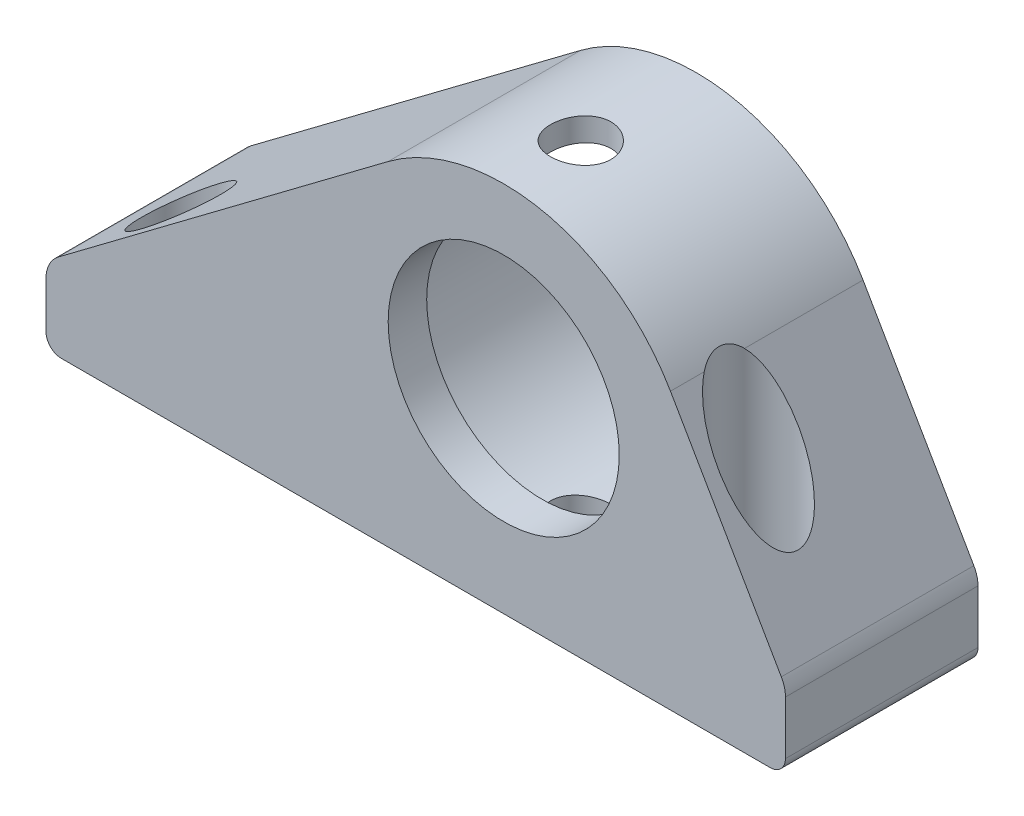
ISO-10303-21;
HEADER;
FILE_DESCRIPTION(('STEP AP214'),'2;1');
FILE_NAME('part.step','',(''),(''),'','','');
FILE_SCHEMA(('AUTOMOTIVE_DESIGN { 1 0 10303 214 1 1 1 1 }'));
ENDSEC;
DATA;
#1=APPLICATION_CONTEXT('core data for automotive mechanical design processes');
#2=APPLICATION_PROTOCOL_DEFINITION('international standard','automotive_design',2000,#1);
#3=PRODUCT_CONTEXT('',#1,'mechanical');
#4=PRODUCT('Part','Part','',(#3));
#5=PRODUCT_RELATED_PRODUCT_CATEGORY('part','',(#4));
#6=PRODUCT_DEFINITION_FORMATION('','',#4);
#7=PRODUCT_DEFINITION_CONTEXT('part definition',#1,'design');
#8=PRODUCT_DEFINITION('design','',#6,#7);
#9=PRODUCT_DEFINITION_SHAPE('','',#8);
#10=(LENGTH_UNIT() NAMED_UNIT(*) SI_UNIT(.MILLI.,.METRE.));
#11=(NAMED_UNIT(*) PLANE_ANGLE_UNIT() SI_UNIT($,.RADIAN.));
#12=(NAMED_UNIT(*) SI_UNIT($,.STERADIAN.) SOLID_ANGLE_UNIT());
#13=UNCERTAINTY_MEASURE_WITH_UNIT(LENGTH_MEASURE(1.E-05),#10,'distance_accuracy_value','');
#14=(GEOMETRIC_REPRESENTATION_CONTEXT(3) GLOBAL_UNCERTAINTY_ASSIGNED_CONTEXT((#13)) GLOBAL_UNIT_ASSIGNED_CONTEXT((#10,
#11,#12)) REPRESENTATION_CONTEXT('',''));
#15=CARTESIAN_POINT('',(0.,0.,0.));
#16=DIRECTION('',(0.,0.,1.));
#17=DIRECTION('',(1.,0.,0.));
#18=AXIS2_PLACEMENT_3D('',#15,#16,#17);
#19=CARTESIAN_POINT('',(30.48,0.,15.875));
#20=DIRECTION('',(0.,1.,0.));
#21=DIRECTION('',(-1.,0.,0.));
#22=AXIS2_PLACEMENT_3D('',#19,#20,#21);
#23=PLANE('',#22);
#24=CARTESIAN_POINT('',(-23.8125,0.,11.43));
#25=DIRECTION('',(0.,-1.,0.));
#26=DIRECTION('',(1.,0.,0.));
#27=AXIS2_PLACEMENT_3D('',#24,#25,#26);
#28=CIRCLE('',#27,3.2639);
#29=CARTESIAN_POINT('',(-20.5486,0.,11.43));
#30=VERTEX_POINT('',#29);
#31=EDGE_CURVE('E460',#30,#30,#28,.T.);
#32=ORIENTED_EDGE('',*,*,#31,.F.);
#33=EDGE_LOOP('',(#32));
#34=FACE_BOUND('',#33,.T.);
#35=CARTESIAN_POINT('',(7.25400300007424,0.,9.525));
#36=DIRECTION('',(0.,-1.,0.));
#37=DIRECTION('',(1.,0.,0.));
#38=AXIS2_PLACEMENT_3D('',#35,#36,#37);
#39=CIRCLE('',#38,2.4892);
#40=CARTESIAN_POINT('',(9.74320300007424,0.,9.525));
#41=VERTEX_POINT('',#40);
#42=EDGE_CURVE('E160',#41,#41,#39,.T.);
#43=ORIENTED_EDGE('',*,*,#42,.F.);
#44=EDGE_LOOP('',(#43));
#45=FACE_BOUND('',#44,.T.);
#46=DIRECTION('',(1.,0.,0.));
#47=VECTOR('',#46,1.);
#48=CARTESIAN_POINT('',(30.48,0.,0.));
#49=LINE('',#48,#47);
#50=CARTESIAN_POINT('',(-29.21,0.,0.));
#51=VERTEX_POINT('',#50);
#52=CARTESIAN_POINT('',(29.21,0.,0.));
#53=VERTEX_POINT('',#52);
#54=EDGE_CURVE('E249',#51,#53,#49,.T.);
#55=ORIENTED_EDGE('',*,*,#54,.T.);
#56=DIRECTION('',(0.,0.,-1.));
#57=VECTOR('',#56,1.);
#58=CARTESIAN_POINT('',(29.21,0.,15.875));
#59=LINE('',#58,#57);
#60=CARTESIAN_POINT('',(29.21,0.,15.875));
#61=VERTEX_POINT('',#60);
#62=EDGE_CURVE('E216',#53,#61,#59,.F.);
#63=ORIENTED_EDGE('',*,*,#62,.T.);
#64=DIRECTION('',(1.,0.,0.));
#65=VECTOR('',#64,1.);
#66=CARTESIAN_POINT('',(30.48,0.,15.875));
#67=LINE('',#66,#65);
#68=CARTESIAN_POINT('',(-29.21,0.,15.875));
#69=VERTEX_POINT('',#68);
#70=EDGE_CURVE('E269',#69,#61,#67,.T.);
#71=ORIENTED_EDGE('',*,*,#70,.F.);
#72=DIRECTION('',(0.,0.,-1.));
#73=VECTOR('',#72,1.);
#74=CARTESIAN_POINT('',(-29.21,0.,15.875));
#75=LINE('',#74,#73);
#76=EDGE_CURVE('E213',#69,#51,#75,.T.);
#77=ORIENTED_EDGE('',*,*,#76,.T.);
#78=EDGE_LOOP('',(#55,#63,#71,#77));
#79=FACE_BOUND('',#78,.T.);
#80=CARTESIAN_POINT('',(23.8125,0.,11.43));
#81=DIRECTION('',(0.,1.,0.));
#82=DIRECTION('',(-1.,0.,0.));
#83=AXIS2_PLACEMENT_3D('',#80,#81,#82);
#84=CIRCLE('',#83,3.2639);
#85=CARTESIAN_POINT('',(20.5486,0.,11.43));
#86=VERTEX_POINT('',#85);
#87=EDGE_CURVE('E459',#86,#86,#84,.T.);
#88=ORIENTED_EDGE('',*,*,#87,.T.);
#89=EDGE_LOOP('',(#88));
#90=FACE_BOUND('',#89,.T.);
#91=ADVANCED_FACE('F33',(#34,#45,#79,#90),#23,.F.);
#92=CARTESIAN_POINT('',(7.25400300007437,14.8286068603137,15.875));
#93=DIRECTION('',(0.,0.,-1.));
#94=DIRECTION('',(-1.,0.,0.));
#95=AXIS2_PLACEMENT_3D('',#92,#93,#94);
#96=CYLINDRICAL_SURFACE('',#95,15.875);
#97=CARTESIAN_POINT('',(7.25400300007436,30.7036068603138,7.0358));
#98=CARTESIAN_POINT('',(7.11509694516908,30.7036045670808,7.03580566830738));
#99=CARTESIAN_POINT('',(6.97611218193528,30.7017646601866,7.04746642785593));
#100=CARTESIAN_POINT('',(6.70203273456269,30.6946020213534,7.09378656350196));
#101=CARTESIAN_POINT('',(6.56694188282754,30.6892759728483,7.12846784077944));
#102=CARTESIAN_POINT('',(6.30465595873273,30.6757391275832,7.2197628200422));
#103=CARTESIAN_POINT('',(6.17745481318327,30.667530582914,7.27635940315972));
#104=CARTESIAN_POINT('',(5.93437285248977,30.649134007626,7.40983538252463));
#105=CARTESIAN_POINT('',(5.81849057811306,30.6389462326777,7.48671215950087));
#106=CARTESIAN_POINT('',(5.60033208226753,30.6176258243704,7.65926248892496));
#107=CARTESIAN_POINT('',(5.49816608869203,30.606486591927,7.75507460388897));
#108=CARTESIAN_POINT('',(5.31129175300056,30.584569925567,7.96247763511765));
#109=CARTESIAN_POINT('',(5.2265844527291,30.5737925132742,8.07406949236609));
#110=CARTESIAN_POINT('',(5.07659786405079,30.5537557811859,8.31061159654533));
#111=CARTESIAN_POINT('',(5.01142616602649,30.5445049901566,8.43563084963722));
#112=CARTESIAN_POINT('',(4.90304851035311,30.5286596153741,8.69501078415887));
#113=CARTESIAN_POINT('',(4.85984124295902,30.5220648732449,8.82937090804669));
#114=CARTESIAN_POINT('',(4.796963270964,30.5123434963266,9.10245557095464));
#115=CARTESIAN_POINT('',(4.77710320592831,30.5091889745406,9.24113549846165));
#116=CARTESIAN_POINT('',(4.76089657591027,30.5066206687459,9.51989261664841));
#117=CARTESIAN_POINT('',(4.76454853711459,30.5072066502696,9.65996971919892));
#118=CARTESIAN_POINT('',(4.79510774717881,30.5120276567733,9.93620169534438));
#119=CARTESIAN_POINT('',(4.82180337883591,30.5162294753171,10.0723806432635));
#120=CARTESIAN_POINT('',(4.8973605430947,30.527756802887,10.3383023139324));
#121=CARTESIAN_POINT('',(4.94622275573279,30.5350824077457,10.4680448390872));
#122=CARTESIAN_POINT('',(5.06494395719598,30.5520682573595,10.7180505107717));
#123=CARTESIAN_POINT('',(5.1348918830656,30.5617383564174,10.838270726423));
#124=CARTESIAN_POINT('',(5.29373568546493,30.5823166097519,11.0653477084882));
#125=CARTESIAN_POINT('',(5.38263291891857,30.5932248526635,11.1722035170324));
#126=CARTESIAN_POINT('',(5.5780100666752,30.6151967100365,11.3707443017527));
#127=CARTESIAN_POINT('',(5.68467177504527,30.6262607183034,11.4622504315872));
#128=CARTESIAN_POINT('',(5.91193242728109,30.6471868004637,11.6260915712206));
#129=CARTESIAN_POINT('',(6.0325314428575,30.6570488681723,11.6984264823729));
#130=CARTESIAN_POINT('',(6.28440356404981,30.6744715991477,11.8218838501579));
#131=CARTESIAN_POINT('',(6.41568393735495,30.6820306785657,11.8729917169162));
#132=CARTESIAN_POINT('',(6.68510938025784,30.693982711525,11.9523846061197));
#133=CARTESIAN_POINT('',(6.8232539414809,30.6983758991658,11.9806713160762));
#134=CARTESIAN_POINT('',(7.10094359993342,30.7034699636867,12.0133792873864));
#135=CARTESIAN_POINT('',(7.24045908082882,30.7042088572259,12.0180462832909));
#136=CARTESIAN_POINT('',(7.51827959411447,30.7020148184516,12.0040357439755));
#137=CARTESIAN_POINT('',(7.65658466740221,30.6990820106842,11.9853590005889));
#138=CARTESIAN_POINT('',(7.92730824076356,30.6898976195341,11.9253955128908));
#139=CARTESIAN_POINT('',(8.05975407998652,30.6836637272211,11.8842292567787));
#140=CARTESIAN_POINT('',(8.31586409195264,30.6685736529816,11.7805829101506));
#141=CARTESIAN_POINT('',(8.43952781928167,30.6597173381678,11.7181017395089));
#142=CARTESIAN_POINT('',(8.67563860325786,30.6402714771111,11.5730280962491));
#143=CARTESIAN_POINT('',(8.78798935863075,30.6296687944835,11.4902806848561));
#144=CARTESIAN_POINT('',(8.99729740357999,30.607949148022,11.3072381432372));
#145=CARTESIAN_POINT('',(9.09425370997436,30.5968321513994,11.2069418930963));
#146=CARTESIAN_POINT('',(9.27092141526545,30.5752153365864,10.990551469592));
#147=CARTESIAN_POINT('',(9.3504675633996,30.5647220679579,10.8743216252251));
#148=CARTESIAN_POINT('',(9.48890613070782,30.5456592820025,10.630005260061));
#149=CARTESIAN_POINT('',(9.54779914763274,30.537089709002,10.50191908255));
#150=CARTESIAN_POINT('',(9.64300711014341,30.5228927057636,10.2380065380913));
#151=CARTESIAN_POINT('',(9.67940715067546,30.5172541997979,10.1022114919798));
#152=CARTESIAN_POINT('',(9.72886557579246,30.5095289481787,9.82633991313193));
#153=CARTESIAN_POINT('',(9.74192573584276,30.5074419323638,9.68626370688804));
#154=CARTESIAN_POINT('',(9.74428853977138,30.5070666718644,9.40745431443618));
#155=CARTESIAN_POINT('',(9.7338511167597,30.5087368643308,9.26872331762411));
#156=CARTESIAN_POINT('',(9.6900740514347,30.515597201827,8.99501636082486));
#157=CARTESIAN_POINT('',(9.65673445991303,30.5207873390504,8.86004039251059));
#158=CARTESIAN_POINT('',(9.56819443372131,30.534087734728,8.59775830460762));
#159=CARTESIAN_POINT('',(9.51301384157173,30.5421953420586,8.47044534380261));
#160=CARTESIAN_POINT('',(9.38238434924553,30.5604201058444,8.226842109909));
#161=CARTESIAN_POINT('',(9.30693463532861,30.5705373429755,8.11055227961739));
#162=CARTESIAN_POINT('',(9.13697081950566,30.5917743120337,7.89097857161323));
#163=CARTESIAN_POINT('',(9.04226469105313,30.6029034623595,7.78784422655511));
#164=CARTESIAN_POINT('',(8.83688213281055,30.62483305306,7.59884086657932));
#165=CARTESIAN_POINT('',(8.72620200791413,30.6356334166778,7.51297585743608));
#166=CARTESIAN_POINT('',(8.49122209404987,30.6557636174166,7.3604800108145));
#167=CARTESIAN_POINT('',(8.36684397860286,30.6650841653116,7.29396864775475));
#168=CARTESIAN_POINT('',(8.10859057986397,30.6811138402597,7.18288238350642));
#169=CARTESIAN_POINT('',(7.9747251443983,30.6878256295893,7.13828510632219));
#170=CARTESIAN_POINT('',(7.74257567355938,30.6963760297984,7.08223803977048));
#171=CARTESIAN_POINT('',(7.64571373853053,30.6990734420586,7.06485088867004));
#172=CARTESIAN_POINT('',(7.45058199718362,30.7026896561761,7.0416299450843));
#173=CARTESIAN_POINT('',(7.35231221090446,30.7036084833238,7.03579598831868));
#174=CARTESIAN_POINT('',(7.25400300007436,30.7036068603138,7.0358));
#175=B_SPLINE_CURVE_WITH_KNOTS('',3,(#97,#98,#99,#100,#101,#102,#103,#104,#105,#106,#107,#108,
#109,#110,#111,#112,#113,#114,#115,#116,#117,#118,#119,#120,#121,#122,#123,#124,#125,#126,#127,
#128,#129,#130,#131,#132,#133,#134,#135,#136,#137,#138,#139,#140,#141,#142,#143,#144,#145,#146,
#147,#148,#149,#150,#151,#152,#153,#154,#155,#156,#157,#158,#159,#160,#161,#162,#163,#164,#165,
#166,#167,#168,#169,#170,#171,#172,#173,#174),.UNSPECIFIED.,.T.,.F.,(4,2,2,2,2,2,2,2,2,2,2,2,2,
2,2,2,2,2,2,2,2,2,2,2,2,2,2,2,2,2,2,2,2,2,2,2,2,2,4),(0.,0.416358886850114,0.833114456601983,
1.24954513752971,1.66592206101775,2.08546693141594,2.50503683083742,2.9268767192471,
3.34869145027715,3.76706086480885,4.18540405478608,4.5999458526052,5.01450036878518,
5.43082849175457,5.8471864372113,6.26810144417729,6.68901861694429,7.11022461967684,
7.5313994734613,7.94818337190888,8.36495313318789,8.77951162893622,9.19409113540896,
9.61194492985803,10.0298254002349,10.4515150266721,10.8731924473988,11.2932646607082,
11.7133049177523,12.1287214978065,12.5441371565667,12.9591762738235,13.3742320560615,
13.793649932368,14.213164984421,14.6352173742595,15.0568379154241,15.3515154632021,
15.6461888207907),.UNSPECIFIED.);
#176=CARTESIAN_POINT('',(7.25400300007436,30.7036068603138,7.0358));
#177=VERTEX_POINT('',#176);
#178=EDGE_CURVE('E134',#177,#177,#175,.T.);
#179=ORIENTED_EDGE('',*,*,#178,.F.);
#180=EDGE_LOOP('',(#179));
#181=FACE_BOUND('',#180,.T.);
#182=DIRECTION('',(0.,0.,-1.));
#183=VECTOR('',#182,1.);
#184=CARTESIAN_POINT('',(21.0021562851524,22.7661068603137,15.875));
#185=LINE('',#184,#183);
#186=CARTESIAN_POINT('',(21.0021562851524,22.7661068603137,13.0898227057178));
#187=VERTEX_POINT('',#186);
#188=CARTESIAN_POINT('',(21.0021562851524,22.7661068603137,15.875));
#189=VERTEX_POINT('',#188);
#190=EDGE_CURVE('E130',#187,#189,#185,.F.);
#191=ORIENTED_EDGE('',*,*,#190,.F.);
#192=CARTESIAN_POINT('',(21.0021562851524,22.7661068603137,13.0898227057178));
#193=CARTESIAN_POINT('',(20.9533733668285,22.8506642981998,13.0072056712202));
#194=CARTESIAN_POINT('',(20.9059806513669,22.9308834683026,12.9186482306213));
#195=CARTESIAN_POINT('',(20.8161566126228,23.0803375507149,12.7285343637837));
#196=CARTESIAN_POINT('',(20.7737923904778,23.1494275345428,12.6268333853953));
#197=CARTESIAN_POINT('',(20.6972629948974,23.2725250502104,12.4105821737075));
#198=CARTESIAN_POINT('',(20.663155677112,23.3264265652036,12.2959490810612));
#199=CARTESIAN_POINT('',(20.6070599093164,23.4143066322154,12.0569972875116));
#200=CARTESIAN_POINT('',(20.5850107900353,23.4483849781978,11.9327307345026));
#201=CARTESIAN_POINT('',(20.557105483573,23.4913828134271,11.6918431381413));
#202=CARTESIAN_POINT('',(20.5497833305059,23.5025819694709,11.5758034890898));
#203=CARTESIAN_POINT('',(20.5476838890129,23.5058003594034,11.3432610913329));
#204=CARTESIAN_POINT('',(20.5529117954202,23.4978116508784,11.2267581707929));
#205=CARTESIAN_POINT('',(20.5738252099067,23.4656343985773,11.0127869718901));
#206=CARTESIAN_POINT('',(20.588055815753,23.4436977657935,10.9148198564839));
#207=CARTESIAN_POINT('',(20.6243594611198,23.387246626405,10.7241436924463));
#208=CARTESIAN_POINT('',(20.6464349132975,23.3527282502418,10.6314362716002));
#209=CARTESIAN_POINT('',(20.7061316561934,23.258315389416,10.4202817276119));
#210=CARTESIAN_POINT('',(20.7464873165251,23.1937578904489,10.3046991713266));
#211=CARTESIAN_POINT('',(20.835187881972,23.0489596235374,10.0874275887423));
#212=CARTESIAN_POINT('',(20.8835399489173,22.968704784688,9.98575116771974));
#213=CARTESIAN_POINT('',(20.9564934029945,22.8448008503922,9.84934535525286));
#214=CARTESIAN_POINT('',(20.9791626099352,22.805941967419,9.80911854426729));
#215=CARTESIAN_POINT('',(21.0021562851523,22.7661068603139,9.77017729428192));
#216=B_SPLINE_CURVE_WITH_KNOTS('',3,(#192,#193,#194,#195,#196,#197,#198,#199,#200,#201,#202,
#203,#204,#205,#206,#207,#208,#209,#210,#211,#212,#213,#214,#215),.UNSPECIFIED.,.F.,.F.,(4,2,2,
2,2,2,2,2,2,2,2,4),(0.,0.38412317117787,0.772902376602331,1.16433162437198,1.5537728900391,
1.90202601303818,2.25042331294998,2.55332079770331,2.85631151833553,3.26923036669984,
3.68252106098251,3.86342961856172),.UNSPECIFIED.);
#217=CARTESIAN_POINT('',(21.0021562851524,22.7661068603137,9.77017729428215));
#218=VERTEX_POINT('',#217);
#219=EDGE_CURVE('E115',#187,#218,#216,.T.);
#220=ORIENTED_EDGE('',*,*,#219,.T.);
#221=CARTESIAN_POINT('',(21.0021562851524,22.7661068603137,0.));
#222=VERTEX_POINT('',#221);
#223=EDGE_CURVE('E132',#222,#218,#185,.F.);
#224=ORIENTED_EDGE('',*,*,#223,.F.);
#225=CARTESIAN_POINT('',(7.25400300007437,14.8286068603137,0.));
#226=DIRECTION('',(0.,0.,1.));
#227=DIRECTION('',(1.,0.,0.));
#228=AXIS2_PLACEMENT_3D('',#225,#226,#227);
#229=CIRCLE('',#228,15.875);
#230=CARTESIAN_POINT('',(-2.27729126755683,27.523883721565,0.));
#231=VERTEX_POINT('',#230);
#232=EDGE_CURVE('E138',#231,#222,#229,.F.);
#233=ORIENTED_EDGE('',*,*,#232,.F.);
#234=DIRECTION('',(0.,0.,-1.));
#235=VECTOR('',#234,1.);
#236=CARTESIAN_POINT('',(-2.27729126755683,27.523883721565,15.875));
#237=LINE('',#236,#235);
#238=CARTESIAN_POINT('',(-2.27729126755683,27.523883721565,15.875));
#239=VERTEX_POINT('',#238);
#240=EDGE_CURVE('E141',#239,#231,#237,.T.);
#241=ORIENTED_EDGE('',*,*,#240,.F.);
#242=CARTESIAN_POINT('',(7.25400300007437,14.8286068603137,15.875));
#243=DIRECTION('',(0.,0.,1.));
#244=DIRECTION('',(1.,0.,0.));
#245=AXIS2_PLACEMENT_3D('',#242,#243,#244);
#246=CIRCLE('',#245,15.875);
#247=EDGE_CURVE('E124',#189,#239,#246,.T.);
#248=ORIENTED_EDGE('',*,*,#247,.F.);
#249=EDGE_LOOP('',(#191,#220,#224,#233,#241,#248));
#250=FACE_BOUND('',#249,.T.);
#251=ADVANCED_FACE('F136',(#181,#250),#96,.T.);
#252=CARTESIAN_POINT('',(-30.48,0.,15.875));
#253=DIRECTION('',(1.,0.,0.));
#254=DIRECTION('',(0.,0.,-1.));
#255=AXIS2_PLACEMENT_3D('',#252,#253,#254);
#256=PLANE('',#255);
#257=DIRECTION('',(0.,-1.,0.));
#258=VECTOR('',#257,1.);
#259=CARTESIAN_POINT('',(-30.48,0.,15.875));
#260=LINE('',#259,#258);
#261=CARTESIAN_POINT('',(-30.48,5.08078683227482,15.875));
#262=VERTEX_POINT('',#261);
#263=CARTESIAN_POINT('',(-30.48,1.27,15.875));
#264=VERTEX_POINT('',#263);
#265=EDGE_CURVE('E241',#262,#264,#260,.T.);
#266=ORIENTED_EDGE('',*,*,#265,.F.);
#267=DIRECTION('',(0.,0.,-1.));
#268=VECTOR('',#267,1.);
#269=CARTESIAN_POINT('',(-30.48,5.08078683227482,15.875));
#270=LINE('',#269,#268);
#271=CARTESIAN_POINT('',(-30.48,5.08078683227482,0.));
#272=VERTEX_POINT('',#271);
#273=EDGE_CURVE('E41',#262,#272,#270,.T.);
#274=ORIENTED_EDGE('',*,*,#273,.T.);
#275=DIRECTION('',(0.,-1.,0.));
#276=VECTOR('',#275,1.);
#277=CARTESIAN_POINT('',(-30.48,0.,0.));
#278=LINE('',#277,#276);
#279=CARTESIAN_POINT('',(-30.48,1.27,0.));
#280=VERTEX_POINT('',#279);
#281=EDGE_CURVE('E240',#272,#280,#278,.T.);
#282=ORIENTED_EDGE('',*,*,#281,.T.);
#283=DIRECTION('',(0.,0.,-1.));
#284=VECTOR('',#283,1.);
#285=CARTESIAN_POINT('',(-30.48,1.27,15.875));
#286=LINE('',#285,#284);
#287=EDGE_CURVE('E222',#280,#264,#286,.F.);
#288=ORIENTED_EDGE('',*,*,#287,.T.);
#289=EDGE_LOOP('',(#266,#274,#282,#288));
#290=FACE_BOUND('',#289,.T.);
#291=ADVANCED_FACE('F192',(#290),#256,.F.);
#292=CARTESIAN_POINT('',(30.48,6.35000000000001,15.875));
#293=DIRECTION('',(-1.,0.,0.));
#294=DIRECTION('',(0.,-1.,0.));
#295=AXIS2_PLACEMENT_3D('',#292,#293,#294);
#296=PLANE('',#295);
#297=DIRECTION('',(0.,1.,0.));
#298=VECTOR('',#297,1.);
#299=CARTESIAN_POINT('',(30.48,6.35000000000001,0.));
#300=LINE('',#299,#298);
#301=CARTESIAN_POINT('',(30.48,1.27000000000002,0.));
#302=VERTEX_POINT('',#301);
#303=CARTESIAN_POINT('',(30.48,5.66940905122498,0.));
#304=VERTEX_POINT('',#303);
#305=EDGE_CURVE('E252',#302,#304,#300,.T.);
#306=ORIENTED_EDGE('',*,*,#305,.T.);
#307=DIRECTION('',(0.,0.,-1.));
#308=VECTOR('',#307,1.);
#309=CARTESIAN_POINT('',(30.48,5.66940905122498,15.875));
#310=LINE('',#309,#308);
#311=CARTESIAN_POINT('',(30.48,5.66940905122498,15.875));
#312=VERTEX_POINT('',#311);
#313=EDGE_CURVE('E232',#304,#312,#310,.F.);
#314=ORIENTED_EDGE('',*,*,#313,.T.);
#315=DIRECTION('',(0.,1.,0.));
#316=VECTOR('',#315,1.);
#317=CARTESIAN_POINT('',(30.48,6.35000000000001,15.875));
#318=LINE('',#317,#316);
#319=CARTESIAN_POINT('',(30.48,1.27000000000002,15.875));
#320=VERTEX_POINT('',#319);
#321=EDGE_CURVE('E267',#320,#312,#318,.T.);
#322=ORIENTED_EDGE('',*,*,#321,.F.);
#323=DIRECTION('',(0.,0.,-1.));
#324=VECTOR('',#323,1.);
#325=CARTESIAN_POINT('',(30.48,1.27000000000002,15.875));
#326=LINE('',#325,#324);
#327=EDGE_CURVE('E123',#320,#302,#326,.T.);
#328=ORIENTED_EDGE('',*,*,#327,.T.);
#329=EDGE_LOOP('',(#306,#314,#322,#328));
#330=FACE_BOUND('',#329,.T.);
#331=ADVANCED_FACE('F320',(#330),#296,.F.);
#332=CARTESIAN_POINT('',(12.0464729957814,38.277805334,15.875));
#333=DIRECTION('',(-0.866025403784442,-0.499999999999995,0.));
#334=DIRECTION('',(0.499999999999995,-0.866025403784442,0.));
#335=AXIS2_PLACEMENT_3D('',#332,#333,#334);
#336=PLANE('',#335);
#337=DIRECTION('',(-0.499999999999995,0.866025403784442,0.));
#338=VECTOR('',#337,1.);
#339=CARTESIAN_POINT('',(12.0464729957814,38.277805334,15.875));
#340=LINE('',#339,#338);
#341=CARTESIAN_POINT('',(30.1397045256125,6.93940905122496,15.875));
#342=VERTEX_POINT('',#341);
#343=EDGE_CURVE('E266',#342,#189,#340,.T.);
#344=ORIENTED_EDGE('',*,*,#343,.F.);
#345=DIRECTION('',(0.,0.,-1.));
#346=VECTOR('',#345,1.);
#347=CARTESIAN_POINT('',(30.1397045256125,6.93940905122496,15.875));
#348=LINE('',#347,#346);
#349=CARTESIAN_POINT('',(30.1397045256125,6.93940905122496,0.));
#350=VERTEX_POINT('',#349);
#351=EDGE_CURVE('E225',#342,#350,#348,.T.);
#352=ORIENTED_EDGE('',*,*,#351,.T.);
#353=DIRECTION('',(-0.499999999999995,0.866025403784442,0.));
#354=VECTOR('',#353,1.);
#355=CARTESIAN_POINT('',(12.0464729957814,38.277805334,0.));
#356=LINE('',#355,#354);
#357=EDGE_CURVE('E262',#350,#222,#356,.T.);
#358=ORIENTED_EDGE('',*,*,#357,.T.);
#359=ORIENTED_EDGE('',*,*,#223,.T.);
#360=CARTESIAN_POINT('',(23.8125,17.8984487594657,11.43));
#361=DIRECTION('',(-0.866025403784442,-0.499999999999995,0.));
#362=DIRECTION('',(0.499999999999995,-0.866025403784442,0.));
#363=AXIS2_PLACEMENT_3D('',#360,#361,#362);
#364=ELLIPSE('',#363,6.52780000000007,3.2639);
#365=EDGE_CURVE('E118',#187,#218,#364,.F.);
#366=ORIENTED_EDGE('',*,*,#365,.F.);
#367=ORIENTED_EDGE('',*,*,#190,.T.);
#368=EDGE_LOOP('',(#344,#352,#358,#359,#366,#367));
#369=FACE_BOUND('',#368,.T.);
#370=ADVANCED_FACE('F129',(#369),#336,.F.);
#371=CARTESIAN_POINT('',(-30.48,6.34999999999999,15.875));
#372=DIRECTION('',(0.600396489299603,-0.799702479448896,0.));
#373=DIRECTION('',(0.799702479448896,0.600396489299603,0.));
#374=AXIS2_PLACEMENT_3D('',#371,#372,#373);
#375=PLANE('',#374);
#376=CARTESIAN_POINT('',(-23.8125,11.3557911476826,11.43));
#377=DIRECTION('',(0.600396489299603,-0.799702479448896,0.));
#378=DIRECTION('',(-0.799702479448896,-0.600396489299603,0.));
#379=AXIS2_PLACEMENT_3D('',#376,#377,#378);
#380=ELLIPSE('',#379,4.08139287282099,3.2639);
#381=CARTESIAN_POINT('',(-27.0764,8.90533719538843,11.43));
#382=VERTEX_POINT('',#381);
#383=EDGE_CURVE('E133',#382,#382,#380,.T.);
#384=ORIENTED_EDGE('',*,*,#383,.T.);
#385=EDGE_LOOP('',(#384));
#386=FACE_BOUND('',#385,.T.);
#387=DIRECTION('',(-0.799702479448896,-0.600396489299603,0.));
#388=VECTOR('',#387,1.);
#389=CARTESIAN_POINT('',(-30.48,6.34999999999999,0.));
#390=LINE('',#389,#388);
#391=CARTESIAN_POINT('',(-29.465007082821,7.11203113007502,0.));
#392=VERTEX_POINT('',#391);
#393=EDGE_CURVE('E264',#231,#392,#390,.T.);
#394=ORIENTED_EDGE('',*,*,#393,.T.);
#395=DIRECTION('',(0.,0.,-1.));
#396=VECTOR('',#395,1.);
#397=CARTESIAN_POINT('',(-29.465007082821,7.11203113007502,15.875));
#398=LINE('',#397,#396);
#399=CARTESIAN_POINT('',(-29.465007082821,7.11203113007502,15.875));
#400=VERTEX_POINT('',#399);
#401=EDGE_CURVE('E11',#392,#400,#398,.F.);
#402=ORIENTED_EDGE('',*,*,#401,.T.);
#403=DIRECTION('',(-0.799702479448896,-0.600396489299603,0.));
#404=VECTOR('',#403,1.);
#405=CARTESIAN_POINT('',(-30.48,6.34999999999999,15.875));
#406=LINE('',#405,#404);
#407=EDGE_CURVE('E257',#239,#400,#406,.T.);
#408=ORIENTED_EDGE('',*,*,#407,.F.);
#409=ORIENTED_EDGE('',*,*,#240,.T.);
#410=EDGE_LOOP('',(#394,#402,#408,#409));
#411=FACE_BOUND('',#410,.T.);
#412=ADVANCED_FACE('F296',(#386,#411),#375,.F.);
#413=CARTESIAN_POINT('',(0.,0.,15.875));
#414=DIRECTION('',(0.,0.,1.));
#415=DIRECTION('',(1.,0.,0.));
#416=AXIS2_PLACEMENT_3D('',#413,#414,#415);
#417=PLANE('',#416);
#418=CARTESIAN_POINT('',(7.25400300007423,16.0986068603137,15.875));
#419=DIRECTION('',(0.,0.,1.));
#420=DIRECTION('',(1.,0.,0.));
#421=AXIS2_PLACEMENT_3D('',#418,#419,#420);
#422=CIRCLE('',#421,9.525);
#423=CARTESIAN_POINT('',(16.7790030000742,16.0986068603137,15.875));
#424=VERTEX_POINT('',#423);
#425=EDGE_CURVE('E149',#424,#424,#422,.T.);
#426=ORIENTED_EDGE('',*,*,#425,.F.);
#427=EDGE_LOOP('',(#426));
#428=FACE_BOUND('',#427,.T.);
#429=ORIENTED_EDGE('',*,*,#321,.T.);
#430=CARTESIAN_POINT('',(27.94,5.66940905122498,15.875));
#431=DIRECTION('',(0.,0.,1.));
#432=DIRECTION('',(1.,0.,0.));
#433=AXIS2_PLACEMENT_3D('',#430,#431,#432);
#434=CIRCLE('',#433,2.54);
#435=EDGE_CURVE('E235',#312,#342,#434,.T.);
#436=ORIENTED_EDGE('',*,*,#435,.T.);
#437=ORIENTED_EDGE('',*,*,#343,.T.);
#438=ORIENTED_EDGE('',*,*,#247,.T.);
#439=ORIENTED_EDGE('',*,*,#407,.T.);
#440=CARTESIAN_POINT('',(-27.94,5.08078683227482,15.875));
#441=DIRECTION('',(0.,0.,1.));
#442=DIRECTION('',(1.,0.,0.));
#443=AXIS2_PLACEMENT_3D('',#440,#441,#442);
#444=CIRCLE('',#443,2.54);
#445=EDGE_CURVE('E48',#400,#262,#444,.T.);
#446=ORIENTED_EDGE('',*,*,#445,.T.);
#447=ORIENTED_EDGE('',*,*,#265,.T.);
#448=CARTESIAN_POINT('',(-29.21,1.27,15.875));
#449=DIRECTION('',(0.,0.,1.));
#450=DIRECTION('',(1.,0.,0.));
#451=AXIS2_PLACEMENT_3D('',#448,#449,#450);
#452=CIRCLE('',#451,1.27);
#453=EDGE_CURVE('E218',#264,#69,#452,.T.);
#454=ORIENTED_EDGE('',*,*,#453,.T.);
#455=ORIENTED_EDGE('',*,*,#70,.T.);
#456=CARTESIAN_POINT('',(29.21,1.27000000000001,15.875));
#457=DIRECTION('',(0.,0.,1.));
#458=DIRECTION('',(1.,0.,0.));
#459=AXIS2_PLACEMENT_3D('',#456,#457,#458);
#460=CIRCLE('',#459,1.27);
#461=EDGE_CURVE('E220',#61,#320,#460,.T.);
#462=ORIENTED_EDGE('',*,*,#461,.T.);
#463=EDGE_LOOP('',(#429,#436,#437,#438,#439,#446,#447,#454,#455,#462));
#464=FACE_BOUND('',#463,.T.);
#465=ADVANCED_FACE('F294',(#428,#464),#417,.T.);
#466=CARTESIAN_POINT('',(0.,0.,0.));
#467=DIRECTION('',(0.,0.,1.));
#468=DIRECTION('',(1.,0.,0.));
#469=AXIS2_PLACEMENT_3D('',#466,#467,#468);
#470=PLANE('',#469);
#471=CARTESIAN_POINT('',(7.25400300007423,16.0986068603137,0.));
#472=DIRECTION('',(0.,0.,1.));
#473=DIRECTION('',(1.,0.,0.));
#474=AXIS2_PLACEMENT_3D('',#471,#472,#473);
#475=CIRCLE('',#474,12.7);
#476=CARTESIAN_POINT('',(19.9540030000742,16.0986068603137,0.));
#477=VERTEX_POINT('',#476);
#478=EDGE_CURVE('E150',#477,#477,#475,.T.);
#479=ORIENTED_EDGE('',*,*,#478,.T.);
#480=EDGE_LOOP('',(#479));
#481=FACE_BOUND('',#480,.T.);
#482=ORIENTED_EDGE('',*,*,#357,.F.);
#483=CARTESIAN_POINT('',(27.94,5.66940905122498,0.));
#484=DIRECTION('',(0.,0.,1.));
#485=DIRECTION('',(1.,0.,0.));
#486=AXIS2_PLACEMENT_3D('',#483,#484,#485);
#487=CIRCLE('',#486,2.54);
#488=EDGE_CURVE('E230',#350,#304,#487,.F.);
#489=ORIENTED_EDGE('',*,*,#488,.T.);
#490=ORIENTED_EDGE('',*,*,#305,.F.);
#491=CARTESIAN_POINT('',(29.21,1.27000000000001,0.));
#492=DIRECTION('',(0.,0.,1.));
#493=DIRECTION('',(1.,0.,0.));
#494=AXIS2_PLACEMENT_3D('',#491,#492,#493);
#495=CIRCLE('',#494,1.27);
#496=EDGE_CURVE('E211',#302,#53,#495,.F.);
#497=ORIENTED_EDGE('',*,*,#496,.T.);
#498=ORIENTED_EDGE('',*,*,#54,.F.);
#499=CARTESIAN_POINT('',(-29.21,1.27,0.));
#500=DIRECTION('',(0.,0.,1.));
#501=DIRECTION('',(1.,0.,0.));
#502=AXIS2_PLACEMENT_3D('',#499,#500,#501);
#503=CIRCLE('',#502,1.27);
#504=EDGE_CURVE('E208',#51,#280,#503,.F.);
#505=ORIENTED_EDGE('',*,*,#504,.T.);
#506=ORIENTED_EDGE('',*,*,#281,.F.);
#507=CARTESIAN_POINT('',(-27.94,5.08078683227482,0.));
#508=DIRECTION('',(0.,0.,1.));
#509=DIRECTION('',(1.,0.,0.));
#510=AXIS2_PLACEMENT_3D('',#507,#508,#509);
#511=CIRCLE('',#510,2.54);
#512=EDGE_CURVE('E228',#272,#392,#511,.F.);
#513=ORIENTED_EDGE('',*,*,#512,.T.);
#514=ORIENTED_EDGE('',*,*,#393,.F.);
#515=ORIENTED_EDGE('',*,*,#232,.T.);
#516=EDGE_LOOP('',(#482,#489,#490,#497,#498,#505,#506,#513,#514,#515));
#517=FACE_BOUND('',#516,.T.);
#518=ADVANCED_FACE('F245',(#481,#517),#470,.F.);
#519=CARTESIAN_POINT('',(7.25400300007423,16.0986068603137,-0.001000000000001));
#520=DIRECTION('',(0.,0.,1.));
#521=DIRECTION('',(1.,0.,0.));
#522=AXIS2_PLACEMENT_3D('',#519,#520,#521);
#523=CYLINDRICAL_SURFACE('',#522,9.525);
#524=CARTESIAN_POINT('',(7.25400300007423,16.0986068603137,12.7));
#525=DIRECTION('',(0.,0.,1.));
#526=DIRECTION('',(1.,0.,0.));
#527=AXIS2_PLACEMENT_3D('',#524,#525,#526);
#528=CIRCLE('',#527,9.525);
#529=CARTESIAN_POINT('',(16.7790030000742,16.0986068603137,12.7));
#530=VERTEX_POINT('',#529);
#531=EDGE_CURVE('E146',#530,#530,#528,.F.);
#532=ORIENTED_EDGE('',*,*,#531,.T.);
#533=EDGE_LOOP('',(#532));
#534=FACE_BOUND('',#533,.T.);
#535=ORIENTED_EDGE('',*,*,#425,.T.);
#536=EDGE_LOOP('',(#535));
#537=FACE_BOUND('',#536,.T.);
#538=ADVANCED_FACE('F287',(#534,#537),#523,.F.);
#539=CARTESIAN_POINT('',(7.25400300007423,16.0986068603137,12.7));
#540=DIRECTION('',(0.,0.,1.));
#541=DIRECTION('',(1.,0.,0.));
#542=AXIS2_PLACEMENT_3D('',#539,#540,#541);
#543=PLANE('',#542);
#544=CARTESIAN_POINT('',(7.25400300007423,16.0986068603137,12.7));
#545=DIRECTION('',(0.,0.,1.));
#546=DIRECTION('',(1.,0.,0.));
#547=AXIS2_PLACEMENT_3D('',#544,#545,#546);
#548=CIRCLE('',#547,12.7);
#549=CARTESIAN_POINT('',(19.9540030000742,16.0986068603137,12.7));
#550=VERTEX_POINT('',#549);
#551=EDGE_CURVE('E205',#550,#550,#548,.T.);
#552=ORIENTED_EDGE('',*,*,#551,.F.);
#553=EDGE_LOOP('',(#552));
#554=FACE_BOUND('',#553,.T.);
#555=ORIENTED_EDGE('',*,*,#531,.F.);
#556=EDGE_LOOP('',(#555));
#557=FACE_BOUND('',#556,.T.);
#558=ADVANCED_FACE('F176',(#554,#557),#543,.F.);
#559=CARTESIAN_POINT('',(7.25400300007423,16.0986068603137,0.));
#560=DIRECTION('',(0.,0.,1.));
#561=DIRECTION('',(1.,0.,0.));
#562=AXIS2_PLACEMENT_3D('',#559,#560,#561);
#563=CYLINDRICAL_SURFACE('',#562,12.7);
#564=CARTESIAN_POINT('',(9.74320300007423,28.552276334007,9.525));
#565=CARTESIAN_POINT('',(9.74319781959507,28.5522790649548,9.38662908287536));
#566=CARTESIAN_POINT('',(9.73162607778495,28.5546075261895,9.24819228470177));
#567=CARTESIAN_POINT('',(9.68568101755662,28.563656788723,8.97523082388027));
#568=CARTESIAN_POINT('',(9.65128909604129,28.5703811735292,8.84070944657046));
#569=CARTESIAN_POINT('',(9.56080761628442,28.5874321112155,8.57956752284425));
#570=CARTESIAN_POINT('',(9.50473919099228,28.5977551547153,8.4529394202798));
#571=CARTESIAN_POINT('',(9.37255353429781,28.6208360963098,8.21089208757875));
#572=CARTESIAN_POINT('',(9.2964375667838,28.6335938408959,8.09547215145594));
#573=CARTESIAN_POINT('',(9.12521511513821,28.6603003424731,7.87754247451788));
#574=CARTESIAN_POINT('',(9.02988855184183,28.6742617167773,7.77520716386536));
#575=CARTESIAN_POINT('',(8.82342642716828,28.7016912066416,7.58787347219764));
#576=CARTESIAN_POINT('',(8.71228978183916,28.7151592883015,7.50287628087115));
#577=CARTESIAN_POINT('',(8.47621021057008,28.7402204893397,7.35195747475635));
#578=CARTESIAN_POINT('',(8.3511596749094,28.7517970003983,7.28620119760572));
#579=CARTESIAN_POINT('',(8.09152070981483,28.7716291301811,7.17669714813406));
#580=CARTESIAN_POINT('',(7.95693313881476,28.7798850473484,7.13294739785695));
#581=CARTESIAN_POINT('',(7.68384992429154,28.7920566394325,7.06924011778699));
#582=CARTESIAN_POINT('',(7.54542538977145,28.7960259734305,7.04898819921367));
#583=CARTESIAN_POINT('',(7.26709031267754,28.7993623635518,7.03193337497407));
#584=CARTESIAN_POINT('',(7.12717990906007,28.7987298463145,7.03512829554281));
#585=CARTESIAN_POINT('',(6.85186622724141,28.7929754962705,7.06465236000583));
#586=CARTESIAN_POINT('',(6.71642747502688,28.7879151937235,7.09066443985872));
#587=CARTESIAN_POINT('',(6.45187525538553,28.7739431164146,7.16458199929412));
#588=CARTESIAN_POINT('',(6.32276203407078,28.7650311919272,7.21248832998449));
#589=CARTESIAN_POINT('',(6.07361646360715,28.744255341242,7.32913096632538));
#590=CARTESIAN_POINT('',(5.953644186923,28.7323737728476,7.39799231439866));
#591=CARTESIAN_POINT('',(5.72683995715791,28.7069698135975,7.55449786688812));
#592=CARTESIAN_POINT('',(5.62000946100786,28.6934472411454,7.64214415090124));
#593=CARTESIAN_POINT('',(5.42064068128666,28.6659890915782,7.83547356857921));
#594=CARTESIAN_POINT('',(5.32837168142999,28.6520503903751,7.94143415867449));
#595=CARTESIAN_POINT('',(5.16287064667453,28.6255462941294,8.16746465929382));
#596=CARTESIAN_POINT('',(5.08963894395472,28.6129809230521,8.28753481596054));
#597=CARTESIAN_POINT('',(4.9642036934437,28.5906405530808,8.53875311566457));
#598=CARTESIAN_POINT('',(4.91204227880375,28.5808711564035,8.66992282697204));
#599=CARTESIAN_POINT('',(4.8305764767098,28.5653121712178,8.93939991212237));
#600=CARTESIAN_POINT('',(4.80126923839401,28.559522086335,9.07770639341906));
#601=CARTESIAN_POINT('',(4.76674313381255,28.5526763406698,9.35509441755145));
#602=CARTESIAN_POINT('',(4.76113604995961,28.5515443861572,9.49412580884298));
#603=CARTESIAN_POINT('',(4.77312606715308,28.5539384804141,9.77113762550663));
#604=CARTESIAN_POINT('',(4.79072190772046,28.5574642761552,9.90911810755894));
#605=CARTESIAN_POINT('',(4.84828406386052,28.5687052800138,10.178815809764));
#606=CARTESIAN_POINT('',(4.88804422889215,28.5763818621579,10.3105787846375));
#607=CARTESIAN_POINT('',(4.98858651648937,28.5950258048394,10.5655728547808));
#608=CARTESIAN_POINT('',(5.04937031193228,28.60599342724,10.6888032701672));
#609=CARTESIAN_POINT('',(5.19111802324772,28.6301558398622,10.9249366734365));
#610=CARTESIAN_POINT('',(5.27232561562493,28.6433768525231,11.0376906504927));
#611=CARTESIAN_POINT('',(5.45228969005974,28.6704838349441,11.2481124049702));
#612=CARTESIAN_POINT('',(5.55104790340508,28.6843698702068,11.3457786922823));
#613=CARTESIAN_POINT('',(5.76504972486813,28.711489106784,11.5247175516523));
#614=CARTESIAN_POINT('',(5.88051428682718,28.7247097139935,11.6057280892576));
#615=CARTESIAN_POINT('',(6.12363988977761,28.7487918284856,11.7472002863924));
#616=CARTESIAN_POINT('',(6.25130043165067,28.7596534322505,11.8076627863857));
#617=CARTESIAN_POINT('',(6.51449388391028,28.7777398293256,11.9059372877511));
#618=CARTESIAN_POINT('',(6.64997867802412,28.7849846585739,11.9438743009439));
#619=CARTESIAN_POINT('',(6.92555331226979,28.7951069963248,11.9964179993294));
#620=CARTESIAN_POINT('',(7.06564261884159,28.7979850090336,12.0110273780141));
#621=CARTESIAN_POINT('',(7.343943532348,28.7990381368231,12.0164002208906));
#622=CARTESIAN_POINT('',(7.48214738068301,28.7972910643415,12.0075582263228));
#623=CARTESIAN_POINT('',(7.75505925888278,28.789453302364,11.9671481595938));
#624=CARTESIAN_POINT('',(7.88976732916311,28.7833626631083,11.935580350293));
#625=CARTESIAN_POINT('',(8.15163010451112,28.7675235867781,11.8507871758175));
#626=CARTESIAN_POINT('',(8.27880008627623,28.7577828625213,11.7976074578334));
#627=CARTESIAN_POINT('',(8.52246941560349,28.7356942683448,11.6711490496278));
#628=CARTESIAN_POINT('',(8.63896796023512,28.7233462024766,11.5978688486784));
#629=CARTESIAN_POINT('',(8.85994328506741,28.6971601124769,11.4319498549602));
#630=CARTESIAN_POINT('',(8.96420507345693,28.6833019135074,11.3390278823627));
#631=CARTESIAN_POINT('',(9.15579188571706,28.6557797035905,11.137046820945));
#632=CARTESIAN_POINT('',(9.24311290298703,28.6421157392872,11.027983925419));
#633=CARTESIAN_POINT('',(9.39918823510413,28.6163749788666,10.7954746338733));
#634=CARTESIAN_POINT('',(9.4677427146263,28.6043159191255,10.671892055115));
#635=CARTESIAN_POINT('',(9.58300532063039,28.5833658792908,10.4147624113143));
#636=CARTESIAN_POINT('',(9.62973352858358,28.574471988854,10.281224637369));
#637=CARTESIAN_POINT('',(9.69081318095695,28.5626605942331,10.0436283138243));
#638=CARTESIAN_POINT('',(9.71042469860954,28.5587902990952,9.94093698210533));
#639=CARTESIAN_POINT('',(9.73662135494774,28.5535971790779,9.73384290783414));
#640=CARTESIAN_POINT('',(9.74320691021948,28.55227427273,9.62944022012084));
#641=CARTESIAN_POINT('',(9.74320300007423,28.552276334007,9.525));
#642=B_SPLINE_CURVE_WITH_KNOTS('',3,(#564,#565,#566,#567,#568,#569,#570,#571,#572,#573,#574,
#575,#576,#577,#578,#579,#580,#581,#582,#583,#584,#585,#586,#587,#588,#589,#590,#591,#592,#593,
#594,#595,#596,#597,#598,#599,#600,#601,#602,#603,#604,#605,#606,#607,#608,#609,#610,#611,#612,
#613,#614,#615,#616,#617,#618,#619,#620,#621,#622,#623,#624,#625,#626,#627,#628,#629,#630,#631,
#632,#633,#634,#635,#636,#637,#638,#639,#640,#641),.UNSPECIFIED.,.T.,.F.,(4,2,2,2,2,2,2,2,2,2,2,
2,2,2,2,2,2,2,2,2,2,2,2,2,2,2,2,2,2,2,2,2,2,2,2,2,2,2,4),(0.,0.414730414305403,
0.829799334472435,1.24446461019687,1.65910374978978,2.07879480704156,2.49851465252995,
2.92174182825096,3.34493095733166,3.76275894344208,4.18054819305723,4.59262226634966,
5.00471235979825,5.41931136201013,5.83395628636838,6.25554457631024,6.67714022199027,
7.09957478601543,7.52195664653157,7.9373922528585,8.35280529193094,8.76441753002944,
9.17606252818106,9.59287344141038,10.0097254939582,10.4327040194989,10.8556652421274,
11.2762566281744,11.6967994477264,12.1103122006605,12.5238201707383,12.9364592596321,
13.3491293704813,13.7682134346203,14.1873964943113,14.6108834376307,15.0339799764711,
15.3470220663788,15.6600541446575),.UNSPECIFIED.);
#643=CARTESIAN_POINT('',(9.74320300007423,28.552276334007,9.525));
#644=VERTEX_POINT('',#643);
#645=EDGE_CURVE('E159',#644,#644,#642,.T.);
#646=ORIENTED_EDGE('',*,*,#645,.T.);
#647=EDGE_LOOP('',(#646));
#648=FACE_BOUND('',#647,.T.);
#649=CARTESIAN_POINT('',(9.74320300007424,3.64493738662045,9.525));
#650=CARTESIAN_POINT('',(9.74319781959507,3.64493465567265,9.66337091712464));
#651=CARTESIAN_POINT('',(9.73162607778496,3.64260619443795,9.80180771529823));
#652=CARTESIAN_POINT('',(9.68568101755663,3.63355693190446,10.0747691761197));
#653=CARTESIAN_POINT('',(9.6512890960413,3.62683254709824,10.2092905534295));
#654=CARTESIAN_POINT('',(9.56080761628442,3.60978160941196,10.4704324771557));
#655=CARTESIAN_POINT('',(9.50473919099229,3.59945856591216,10.5970605797202));
#656=CARTESIAN_POINT('',(9.37255353429782,3.57637762431768,10.8391079124212));
#657=CARTESIAN_POINT('',(9.2964375667838,3.5636198797316,10.9545278485441));
#658=CARTESIAN_POINT('',(9.12521511513822,3.53691337815434,11.1724575254821));
#659=CARTESIAN_POINT('',(9.02988855184184,3.52295200385019,11.2747928361346));
#660=CARTESIAN_POINT('',(8.82342642716829,3.49552251398588,11.4621265278024));
#661=CARTESIAN_POINT('',(8.71228978183917,3.48205443232593,11.5471237191288));
#662=CARTESIAN_POINT('',(8.47621021057009,3.45699323128774,11.6980425252437));
#663=CARTESIAN_POINT('',(8.3511596749094,3.44541672022916,11.7637988023943));
#664=CARTESIAN_POINT('',(8.09152070981484,3.42558459044636,11.8733028518659));
#665=CARTESIAN_POINT('',(7.95693313881477,3.4173286732791,11.9170526021431));
#666=CARTESIAN_POINT('',(7.68384992429155,3.40515708119496,11.980759882213));
#667=CARTESIAN_POINT('',(7.54542538977146,3.40118774719697,12.0010118007863));
#668=CARTESIAN_POINT('',(7.26709031267754,3.39785135707567,12.0180666250259));
#669=CARTESIAN_POINT('',(7.12717990906008,3.39848387431302,12.0148717044572));
#670=CARTESIAN_POINT('',(6.85186622724142,3.40423822435695,11.9853476399942));
#671=CARTESIAN_POINT('',(6.71642747502688,3.40929852690399,11.9593355601413));
#672=CARTESIAN_POINT('',(6.45187525538553,3.42327060421288,11.8854180007059));
#673=CARTESIAN_POINT('',(6.32276203407079,3.43218252870032,11.8375116700155));
#674=CARTESIAN_POINT('',(6.07361646360716,3.45295837938551,11.7208690336746));
#675=CARTESIAN_POINT('',(5.95364418692301,3.46483994777991,11.6520076856013));
#676=CARTESIAN_POINT('',(5.72683995715792,3.49024390703002,11.4955021331119));
#677=CARTESIAN_POINT('',(5.62000946100787,3.50376647948205,11.4078558490988));
#678=CARTESIAN_POINT('',(5.42064068128666,3.53122462904927,11.2145264314208));
#679=CARTESIAN_POINT('',(5.32837168143,3.54516333025239,11.1085658413255));
#680=CARTESIAN_POINT('',(5.16287064667454,3.57166742649804,10.8825353407062));
#681=CARTESIAN_POINT('',(5.08963894395473,3.58423279757532,10.7624651840395));
#682=CARTESIAN_POINT('',(4.9642036934437,3.60657316754668,10.5112468843354));
#683=CARTESIAN_POINT('',(4.91204227880376,3.61634256422393,10.380077173028));
#684=CARTESIAN_POINT('',(4.83057647670981,3.63190154940971,10.1106000878776));
#685=CARTESIAN_POINT('',(4.80126923839402,3.63769163429243,9.97229360658093));
#686=CARTESIAN_POINT('',(4.76674313381256,3.6445373799577,9.69490558244855));
#687=CARTESIAN_POINT('',(4.76113604995962,3.64566933447023,9.55587419115701));
#688=CARTESIAN_POINT('',(4.77312606715309,3.64327524021339,9.27886237449337));
#689=CARTESIAN_POINT('',(4.79072190772047,3.6397494444723,9.14088189244105));
#690=CARTESIAN_POINT('',(4.84828406386052,3.62850844061367,8.87118419023599));
#691=CARTESIAN_POINT('',(4.88804422889216,3.62083185846961,8.73942121536253));
#692=CARTESIAN_POINT('',(4.98858651648938,3.60218791578808,8.48442714521915));
#693=CARTESIAN_POINT('',(5.04937031193229,3.5912202933875,8.36119672983276));
#694=CARTESIAN_POINT('',(5.19111802324773,3.56705788076527,8.1250633265635));
#695=CARTESIAN_POINT('',(5.27232561562494,3.55383686810434,8.01230934950728));
#696=CARTESIAN_POINT('',(5.45228969005974,3.52672988568336,7.80188759502976));
#697=CARTESIAN_POINT('',(5.55104790340509,3.51284385042072,7.70422130771773));
#698=CARTESIAN_POINT('',(5.76504972486814,3.48572461384346,7.52528244834767));
#699=CARTESIAN_POINT('',(5.88051428682718,3.47250400663398,7.44427191074244));
#700=CARTESIAN_POINT('',(6.12363988977762,3.44842189214191,7.30279971360759));
#701=CARTESIAN_POINT('',(6.25130043165067,3.43756028837702,7.24233721361427));
#702=CARTESIAN_POINT('',(6.51449388391029,3.41947389130192,7.14406271224889));
#703=CARTESIAN_POINT('',(6.64997867802413,3.41222906205357,7.10612569905611));
#704=CARTESIAN_POINT('',(6.9255533122698,3.4021067243027,7.05358200067058));
#705=CARTESIAN_POINT('',(7.0656426188416,3.39922871159387,7.03897262198589));
#706=CARTESIAN_POINT('',(7.34394353234801,3.39817558380443,7.03359977910936));
#707=CARTESIAN_POINT('',(7.48214738068302,3.39992265628598,7.04244177367724));
#708=CARTESIAN_POINT('',(7.75505925888279,3.40776041826349,7.08285184040616));
#709=CARTESIAN_POINT('',(7.88976732916312,3.41385105751918,7.11441964970699));
#710=CARTESIAN_POINT('',(8.15163010451113,3.42969013384933,7.19921282418249));
#711=CARTESIAN_POINT('',(8.27880008627624,3.43943085810615,7.25239254216657));
#712=CARTESIAN_POINT('',(8.52246941560351,3.46151945228263,7.37885095037216));
#713=CARTESIAN_POINT('',(8.63896796023512,3.47386751815086,7.4521311513216));
#714=CARTESIAN_POINT('',(8.85994328506742,3.50005360815062,7.61805014503978));
#715=CARTESIAN_POINT('',(8.96420507345694,3.51391180712005,7.7109721176373));
#716=CARTESIAN_POINT('',(9.15579188571706,3.54143401703694,7.91295317905497));
#717=CARTESIAN_POINT('',(9.24311290298704,3.55509798134024,8.02201607458102));
#718=CARTESIAN_POINT('',(9.39918823510414,3.58083874176086,8.25452536612666));
#719=CARTESIAN_POINT('',(9.4677427146263,3.59289780150193,8.37810794488504));
#720=CARTESIAN_POINT('',(9.5830053206304,3.61384784133665,8.63523758868569));
#721=CARTESIAN_POINT('',(9.62973352858358,3.62274173177351,8.76877536263104));
#722=CARTESIAN_POINT('',(9.69081318095695,3.6345531263944,9.0063716861757));
#723=CARTESIAN_POINT('',(9.71042469860955,3.63842342153233,9.10906301789467));
#724=CARTESIAN_POINT('',(9.73662135494775,3.64361654154957,9.31615709216586));
#725=CARTESIAN_POINT('',(9.74320691021948,3.64493944789746,9.42055977987916));
#726=CARTESIAN_POINT('',(9.74320300007424,3.64493738662045,9.525));
#727=B_SPLINE_CURVE_WITH_KNOTS('',3,(#649,#650,#651,#652,#653,#654,#655,#656,#657,#658,#659,
#660,#661,#662,#663,#664,#665,#666,#667,#668,#669,#670,#671,#672,#673,#674,#675,#676,#677,#678,
#679,#680,#681,#682,#683,#684,#685,#686,#687,#688,#689,#690,#691,#692,#693,#694,#695,#696,#697,
#698,#699,#700,#701,#702,#703,#704,#705,#706,#707,#708,#709,#710,#711,#712,#713,#714,#715,#716,
#717,#718,#719,#720,#721,#722,#723,#724,#725,#726),.UNSPECIFIED.,.T.,.F.,(4,2,2,2,2,2,2,2,2,2,2,
2,2,2,2,2,2,2,2,2,2,2,2,2,2,2,2,2,2,2,2,2,2,2,2,2,2,2,4),(0.,0.414730414305403,
0.829799334472434,1.24446461019686,1.65910374978978,2.07879480704156,2.49851465252995,
2.92174182825097,3.34493095733166,3.76275894344208,4.18054819305722,4.59262226634966,
5.00471235979825,5.41931136201013,5.83395628636838,6.25554457631024,6.67714022199027,
7.09957478601544,7.52195664653158,7.9373922528585,8.35280529193094,8.76441753002944,
9.17606252818106,9.59287344141039,10.0097254939582,10.4327040194989,10.8556652421274,
11.2762566281744,11.6967994477264,12.1103122006605,12.5238201707383,12.9364592596322,
13.3491293704813,13.7682134346202,14.1873964943113,14.6108834376307,15.0339799764711,
15.3470220663788,15.6600541446575),.UNSPECIFIED.);
#728=CARTESIAN_POINT('',(9.74320300007424,3.64493738662045,9.525));
#729=VERTEX_POINT('',#728);
#730=EDGE_CURVE('E151',#729,#729,#727,.T.);
#731=ORIENTED_EDGE('',*,*,#730,.T.);
#732=EDGE_LOOP('',(#731));
#733=FACE_BOUND('',#732,.T.);
#734=ORIENTED_EDGE('',*,*,#478,.F.);
#735=EDGE_LOOP('',(#734));
#736=FACE_BOUND('',#735,.T.);
#737=ORIENTED_EDGE('',*,*,#551,.T.);
#738=EDGE_LOOP('',(#737));
#739=FACE_BOUND('',#738,.T.);
#740=ADVANCED_FACE('F164',(#648,#733,#736,#739),#563,.F.);
#741=CARTESIAN_POINT('',(7.25400300007423,30.7036068603138,9.525));
#742=DIRECTION('',(0.,-1.,0.));
#743=DIRECTION('',(1.,0.,0.));
#744=AXIS2_PLACEMENT_3D('',#741,#742,#743);
#745=CYLINDRICAL_SURFACE('',#744,2.4892);
#746=ORIENTED_EDGE('',*,*,#42,.T.);
#747=EDGE_LOOP('',(#746));
#748=FACE_BOUND('',#747,.T.);
#749=ORIENTED_EDGE('',*,*,#730,.F.);
#750=EDGE_LOOP('',(#749));
#751=FACE_BOUND('',#750,.T.);
#752=ADVANCED_FACE('F172',(#748,#751),#745,.F.);
#753=ORIENTED_EDGE('',*,*,#178,.T.);
#754=EDGE_LOOP('',(#753));
#755=FACE_BOUND('',#754,.T.);
#756=ORIENTED_EDGE('',*,*,#645,.F.);
#757=EDGE_LOOP('',(#756));
#758=FACE_BOUND('',#757,.T.);
#759=ADVANCED_FACE('F168',(#755,#758),#745,.F.);
#760=CARTESIAN_POINT('',(23.8125,30.7036068603138,11.43));
#761=DIRECTION('',(0.,-1.,0.));
#762=DIRECTION('',(1.,0.,0.));
#763=AXIS2_PLACEMENT_3D('',#760,#761,#762);
#764=CYLINDRICAL_SURFACE('',#763,3.2639);
#765=ORIENTED_EDGE('',*,*,#87,.F.);
#766=EDGE_LOOP('',(#765));
#767=FACE_BOUND('',#766,.T.);
#768=ORIENTED_EDGE('',*,*,#365,.T.);
#769=ORIENTED_EDGE('',*,*,#219,.F.);
#770=EDGE_LOOP('',(#768,#769));
#771=FACE_BOUND('',#770,.T.);
#772=ADVANCED_FACE('F117',(#767,#771),#764,.F.);
#773=CARTESIAN_POINT('',(-23.8125,30.7036068603137,11.43));
#774=DIRECTION('',(0.,-1.,0.));
#775=DIRECTION('',(1.,0.,0.));
#776=AXIS2_PLACEMENT_3D('',#773,#774,#775);
#777=CYLINDRICAL_SURFACE('',#776,3.2639);
#778=ORIENTED_EDGE('',*,*,#31,.T.);
#779=EDGE_LOOP('',(#778));
#780=FACE_BOUND('',#779,.T.);
#781=ORIENTED_EDGE('',*,*,#383,.F.);
#782=EDGE_LOOP('',(#781));
#783=FACE_BOUND('',#782,.T.);
#784=ADVANCED_FACE('F363',(#780,#783),#777,.F.);
#785=CARTESIAN_POINT('',(29.21,1.27000000000001,15.875));
#786=DIRECTION('',(0.,0.,-1.));
#787=DIRECTION('',(-1.,0.,0.));
#788=AXIS2_PLACEMENT_3D('',#785,#786,#787);
#789=CYLINDRICAL_SURFACE('',#788,1.27);
#790=ORIENTED_EDGE('',*,*,#461,.F.);
#791=ORIENTED_EDGE('',*,*,#62,.F.);
#792=ORIENTED_EDGE('',*,*,#496,.F.);
#793=ORIENTED_EDGE('',*,*,#327,.F.);
#794=EDGE_LOOP('',(#790,#791,#792,#793));
#795=FACE_BOUND('',#794,.T.);
#796=ADVANCED_FACE('F195',(#795),#789,.T.);
#797=CARTESIAN_POINT('',(-29.21,1.27,15.875));
#798=DIRECTION('',(0.,0.,-1.));
#799=DIRECTION('',(-1.,0.,0.));
#800=AXIS2_PLACEMENT_3D('',#797,#798,#799);
#801=CYLINDRICAL_SURFACE('',#800,1.27);
#802=ORIENTED_EDGE('',*,*,#453,.F.);
#803=ORIENTED_EDGE('',*,*,#287,.F.);
#804=ORIENTED_EDGE('',*,*,#504,.F.);
#805=ORIENTED_EDGE('',*,*,#76,.F.);
#806=EDGE_LOOP('',(#802,#803,#804,#805));
#807=FACE_BOUND('',#806,.T.);
#808=ADVANCED_FACE('F312',(#807),#801,.T.);
#809=CARTESIAN_POINT('',(27.94,5.66940905122498,15.875));
#810=DIRECTION('',(0.,0.,-1.));
#811=DIRECTION('',(-1.,0.,0.));
#812=AXIS2_PLACEMENT_3D('',#809,#810,#811);
#813=CYLINDRICAL_SURFACE('',#812,2.54);
#814=ORIENTED_EDGE('',*,*,#435,.F.);
#815=ORIENTED_EDGE('',*,*,#313,.F.);
#816=ORIENTED_EDGE('',*,*,#488,.F.);
#817=ORIENTED_EDGE('',*,*,#351,.F.);
#818=EDGE_LOOP('',(#814,#815,#816,#817));
#819=FACE_BOUND('',#818,.T.);
#820=ADVANCED_FACE('F306',(#819),#813,.T.);
#821=CARTESIAN_POINT('',(-27.94,5.08078683227482,15.875));
#822=DIRECTION('',(0.,0.,-1.));
#823=DIRECTION('',(-1.,0.,0.));
#824=AXIS2_PLACEMENT_3D('',#821,#822,#823);
#825=CYLINDRICAL_SURFACE('',#824,2.54);
#826=ORIENTED_EDGE('',*,*,#445,.F.);
#827=ORIENTED_EDGE('',*,*,#401,.F.);
#828=ORIENTED_EDGE('',*,*,#512,.F.);
#829=ORIENTED_EDGE('',*,*,#273,.F.);
#830=EDGE_LOOP('',(#826,#827,#828,#829));
#831=FACE_BOUND('',#830,.T.);
#832=ADVANCED_FACE('F35',(#831),#825,.T.);
#833=CLOSED_SHELL('',(#91,#251,#291,#331,#370,#412,#465,#518,#538,#558,#740,#752,#759,#772,#784,
#796,#808,#820,#832));
#834=MANIFOLD_SOLID_BREP('B2',#833);
#835=ADVANCED_BREP_SHAPE_REPRESENTATION('',(#18,#834),#14);
#836=SHAPE_DEFINITION_REPRESENTATION(#9,#835);
ENDSEC;
END-ISO-10303-21;
